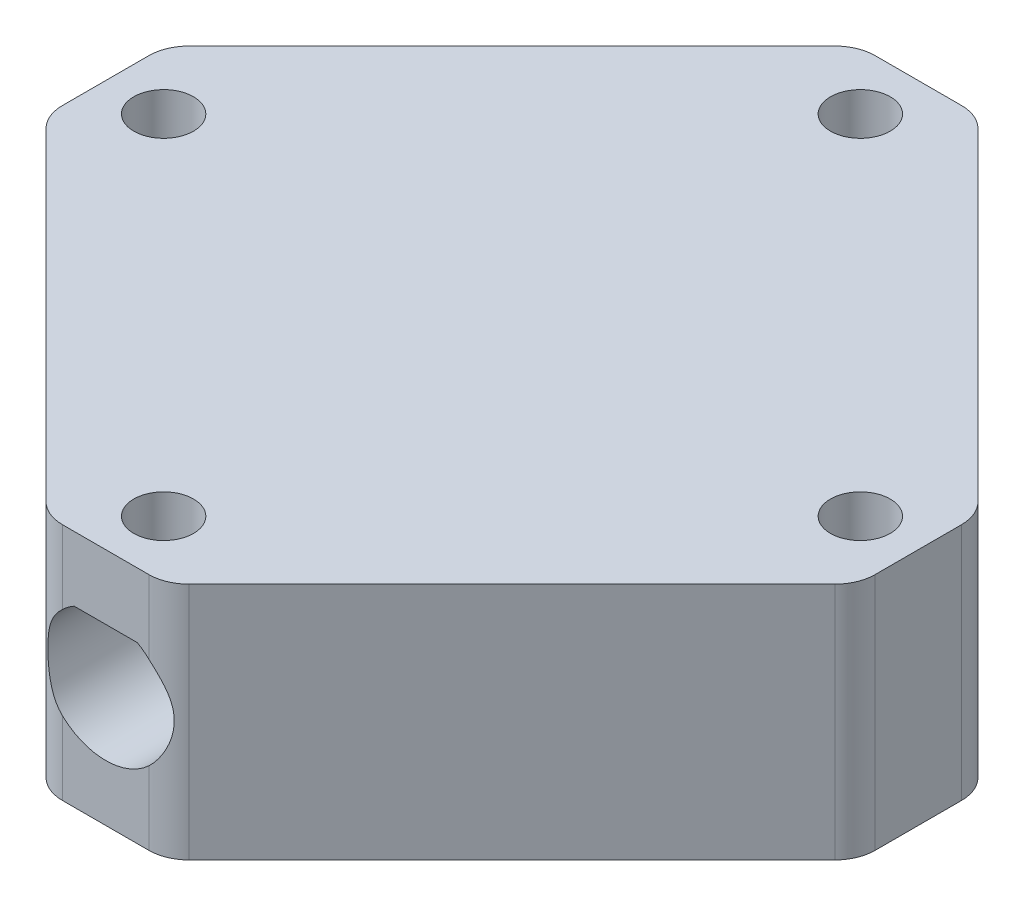
ISO-10303-21;
HEADER;
FILE_DESCRIPTION(('STEP AP214'),'2;1');
FILE_NAME('part.step','',(''),(''),'','','');
FILE_SCHEMA(('AUTOMOTIVE_DESIGN { 1 0 10303 214 1 1 1 1 }'));
ENDSEC;
DATA;
#1=APPLICATION_CONTEXT('core data for automotive mechanical design processes');
#2=APPLICATION_PROTOCOL_DEFINITION('international standard','automotive_design',2000,#1);
#3=PRODUCT_CONTEXT('',#1,'mechanical');
#4=PRODUCT('Part','Part','',(#3));
#5=PRODUCT_RELATED_PRODUCT_CATEGORY('part','',(#4));
#6=PRODUCT_DEFINITION_FORMATION('','',#4);
#7=PRODUCT_DEFINITION_CONTEXT('part definition',#1,'design');
#8=PRODUCT_DEFINITION('design','',#6,#7);
#9=PRODUCT_DEFINITION_SHAPE('','',#8);
#10=(LENGTH_UNIT() NAMED_UNIT(*) SI_UNIT(.MILLI.,.METRE.));
#11=(NAMED_UNIT(*) PLANE_ANGLE_UNIT() SI_UNIT($,.RADIAN.));
#12=(NAMED_UNIT(*) SI_UNIT($,.STERADIAN.) SOLID_ANGLE_UNIT());
#13=UNCERTAINTY_MEASURE_WITH_UNIT(LENGTH_MEASURE(1.E-05),#10,'distance_accuracy_value','');
#14=(GEOMETRIC_REPRESENTATION_CONTEXT(3) GLOBAL_UNCERTAINTY_ASSIGNED_CONTEXT((#13)) GLOBAL_UNIT_ASSIGNED_CONTEXT((#10,
#11,#12)) REPRESENTATION_CONTEXT('',''));
#15=CARTESIAN_POINT('',(0.,0.,0.));
#16=DIRECTION('',(0.,0.,1.));
#17=DIRECTION('',(1.,0.,0.));
#18=AXIS2_PLACEMENT_3D('',#15,#16,#17);
#19=CARTESIAN_POINT('',(-3.00000000000014,12.,20.41));
#20=DIRECTION('',(0.,0.,-1.));
#21=DIRECTION('',(-1.,0.,0.));
#22=AXIS2_PLACEMENT_3D('',#19,#20,#21);
#23=PLANE('',#22);
#24=CARTESIAN_POINT('',(-1.06217118434059E-13,6.,20.41));
#25=DIRECTION('',(0.,0.,1.));
#26=DIRECTION('',(1.,0.,0.));
#27=AXIS2_PLACEMENT_3D('',#24,#25,#26);
#28=CIRCLE('',#27,3.175);
#29=CARTESIAN_POINT('',(2.17157287525374,8.31622456758013,20.41));
#30=VERTEX_POINT('',#29);
#31=CARTESIAN_POINT('',(1.58749999999989,8.74963065701559,20.41));
#32=VERTEX_POINT('',#31);
#33=EDGE_CURVE('E195',#30,#32,#28,.T.);
#34=ORIENTED_EDGE('',*,*,#33,.F.);
#35=DIRECTION('',(0.,-1.,0.));
#36=VECTOR('',#35,1.);
#37=CARTESIAN_POINT('',(2.17157287525374,12.,20.41));
#38=LINE('',#37,#36);
#39=CARTESIAN_POINT('',(2.17157287525374,12.,20.41));
#40=VERTEX_POINT('',#39);
#41=EDGE_CURVE('E466',#30,#40,#38,.F.);
#42=ORIENTED_EDGE('',*,*,#41,.T.);
#43=DIRECTION('',(1.,0.,0.));
#44=VECTOR('',#43,1.);
#45=CARTESIAN_POINT('',(-3.00000000000014,12.,20.41));
#46=LINE('',#45,#44);
#47=CARTESIAN_POINT('',(-2.17157287525395,12.,20.41));
#48=VERTEX_POINT('',#47);
#49=EDGE_CURVE('E240',#48,#40,#46,.T.);
#50=ORIENTED_EDGE('',*,*,#49,.F.);
#51=DIRECTION('',(0.,-1.,0.));
#52=VECTOR('',#51,1.);
#53=CARTESIAN_POINT('',(-2.17157287525395,12.,20.41));
#54=LINE('',#53,#52);
#55=CARTESIAN_POINT('',(-2.17157287525395,8.31622456758013,20.41));
#56=VERTEX_POINT('',#55);
#57=EDGE_CURVE('E51',#48,#56,#54,.T.);
#58=ORIENTED_EDGE('',*,*,#57,.T.);
#59=CARTESIAN_POINT('',(-1.58750000000011,8.74963065701559,20.41));
#60=VERTEX_POINT('',#59);
#61=EDGE_CURVE('E189',#60,#56,#28,.T.);
#62=ORIENTED_EDGE('',*,*,#61,.F.);
#63=DIRECTION('',(-1.,0.,0.));
#64=VECTOR('',#63,1.);
#65=CARTESIAN_POINT('',(1.58749999999989,8.74963065701559,20.41));
#66=LINE('',#65,#64);
#67=EDGE_CURVE('E182',#32,#60,#66,.T.);
#68=ORIENTED_EDGE('',*,*,#67,.F.);
#69=EDGE_LOOP('',(#34,#42,#50,#58,#62,#68));
#70=FACE_BOUND('',#69,.T.);
#71=ADVANCED_FACE('F35',(#70),#23,.F.);
#72=CARTESIAN_POINT('',(20.4100000000002,12.,-3.00000000000029));
#73=DIRECTION('',(-0.707106781186545,0.,0.707106781186549));
#74=DIRECTION('',(0.70710678118655,0.,0.707106781186545));
#75=AXIS2_PLACEMENT_3D('',#72,#73,#74);
#76=PLANE('',#75);
#77=DIRECTION('',(-0.70710678118655,0.,-0.707106781186545));
#78=VECTOR('',#77,1.);
#79=CARTESIAN_POINT('',(20.4100000000002,0.,-3.00000000000029));
#80=LINE('',#79,#78);
#81=CARTESIAN_POINT('',(19.8242135623732,0.,-3.58578643762722));
#82=VERTEX_POINT('',#81);
#83=CARTESIAN_POINT('',(3.58578643762701,0.,-19.8242135623733));
#84=VERTEX_POINT('',#83);
#85=EDGE_CURVE('E203',#82,#84,#80,.T.);
#86=ORIENTED_EDGE('',*,*,#85,.T.);
#87=DIRECTION('',(0.,-1.,0.));
#88=VECTOR('',#87,1.);
#89=CARTESIAN_POINT('',(3.58578643762701,12.,-19.8242135623733));
#90=LINE('',#89,#88);
#91=CARTESIAN_POINT('',(3.58578643762701,12.,-19.8242135623733));
#92=VERTEX_POINT('',#91);
#93=EDGE_CURVE('E328',#84,#92,#90,.F.);
#94=ORIENTED_EDGE('',*,*,#93,.T.);
#95=DIRECTION('',(-0.70710678118655,0.,-0.707106781186545));
#96=VECTOR('',#95,1.);
#97=CARTESIAN_POINT('',(20.4100000000002,12.,-3.00000000000029));
#98=LINE('',#97,#96);
#99=CARTESIAN_POINT('',(19.8242135623732,12.,-3.58578643762722));
#100=VERTEX_POINT('',#99);
#101=EDGE_CURVE('E224',#100,#92,#98,.T.);
#102=ORIENTED_EDGE('',*,*,#101,.F.);
#103=DIRECTION('',(0.,-1.,0.));
#104=VECTOR('',#103,1.);
#105=CARTESIAN_POINT('',(19.8242135623732,12.,-3.58578643762722));
#106=LINE('',#105,#104);
#107=EDGE_CURVE('E325',#100,#82,#106,.T.);
#108=ORIENTED_EDGE('',*,*,#107,.T.);
#109=EDGE_LOOP('',(#86,#94,#102,#108));
#110=FACE_BOUND('',#109,.T.);
#111=ADVANCED_FACE('F425',(#110),#76,.F.);
#112=CARTESIAN_POINT('',(-2.9999999999999,12.,-20.4100000000002));
#113=DIRECTION('',(0.,0.,1.));
#114=DIRECTION('',(1.,0.,0.));
#115=AXIS2_PLACEMENT_3D('',#112,#113,#114);
#116=PLANE('',#115);
#117=DIRECTION('',(-1.,0.,0.));
#118=VECTOR('',#117,1.);
#119=CARTESIAN_POINT('',(-2.9999999999999,0.,-20.4100000000002));
#120=LINE('',#119,#118);
#121=CARTESIAN_POINT('',(2.17157287525392,0.,-20.4100000000002));
#122=VERTEX_POINT('',#121);
#123=CARTESIAN_POINT('',(-2.1715728752537,0.,-20.4100000000002));
#124=VERTEX_POINT('',#123);
#125=EDGE_CURVE('E252',#122,#124,#120,.T.);
#126=ORIENTED_EDGE('',*,*,#125,.T.);
#127=DIRECTION('',(0.,-1.,0.));
#128=VECTOR('',#127,1.);
#129=CARTESIAN_POINT('',(-2.1715728752537,12.,-20.4100000000002));
#130=LINE('',#129,#128);
#131=CARTESIAN_POINT('',(-2.1715728752537,12.,-20.4100000000002));
#132=VERTEX_POINT('',#131);
#133=EDGE_CURVE('E323',#124,#132,#130,.F.);
#134=ORIENTED_EDGE('',*,*,#133,.T.);
#135=DIRECTION('',(-1.,0.,0.));
#136=VECTOR('',#135,1.);
#137=CARTESIAN_POINT('',(-2.9999999999999,12.,-20.4100000000002));
#138=LINE('',#137,#136);
#139=CARTESIAN_POINT('',(2.17157287525392,12.,-20.4100000000002));
#140=VERTEX_POINT('',#139);
#141=EDGE_CURVE('E227',#140,#132,#138,.T.);
#142=ORIENTED_EDGE('',*,*,#141,.F.);
#143=DIRECTION('',(0.,-1.,0.));
#144=VECTOR('',#143,1.);
#145=CARTESIAN_POINT('',(2.17157287525392,12.,-20.4100000000002));
#146=LINE('',#145,#144);
#147=EDGE_CURVE('E320',#140,#122,#146,.T.);
#148=ORIENTED_EDGE('',*,*,#147,.T.);
#149=EDGE_LOOP('',(#126,#134,#142,#148));
#150=FACE_BOUND('',#149,.T.);
#151=ADVANCED_FACE('F421',(#150),#116,.F.);
#152=CARTESIAN_POINT('',(-2.9999999999999,12.,-20.4100000000002));
#153=DIRECTION('',(0.70710678118655,0.,0.707106781186545));
#154=DIRECTION('',(0.707106781186545,0.,-0.70710678118655));
#155=AXIS2_PLACEMENT_3D('',#152,#153,#154);
#156=PLANE('',#155);
#157=DIRECTION('',(-0.707106781186545,0.,0.70710678118655));
#158=VECTOR('',#157,1.);
#159=CARTESIAN_POINT('',(-2.9999999999999,0.,-20.4100000000002));
#160=LINE('',#159,#158);
#161=CARTESIAN_POINT('',(-3.5857864376268,0.,-19.8242135623733));
#162=VERTEX_POINT('',#161);
#163=CARTESIAN_POINT('',(-19.824213562373,0.,-3.58578643762707));
#164=VERTEX_POINT('',#163);
#165=EDGE_CURVE('E255',#162,#164,#160,.T.);
#166=ORIENTED_EDGE('',*,*,#165,.T.);
#167=DIRECTION('',(0.,-1.,0.));
#168=VECTOR('',#167,1.);
#169=CARTESIAN_POINT('',(-19.824213562373,12.,-3.58578643762707));
#170=LINE('',#169,#168);
#171=CARTESIAN_POINT('',(-19.824213562373,12.,-3.58578643762707));
#172=VERTEX_POINT('',#171);
#173=EDGE_CURVE('E318',#164,#172,#170,.F.);
#174=ORIENTED_EDGE('',*,*,#173,.T.);
#175=DIRECTION('',(-0.707106781186545,0.,0.70710678118655));
#176=VECTOR('',#175,1.);
#177=CARTESIAN_POINT('',(-2.9999999999999,12.,-20.4100000000002));
#178=LINE('',#177,#176);
#179=CARTESIAN_POINT('',(-3.5857864376268,12.,-19.8242135623733));
#180=VERTEX_POINT('',#179);
#181=EDGE_CURVE('E231',#180,#172,#178,.T.);
#182=ORIENTED_EDGE('',*,*,#181,.F.);
#183=DIRECTION('',(0.,-1.,0.));
#184=VECTOR('',#183,1.);
#185=CARTESIAN_POINT('',(-3.5857864376268,12.,-19.8242135623733));
#186=LINE('',#185,#184);
#187=EDGE_CURVE('E315',#180,#162,#186,.T.);
#188=ORIENTED_EDGE('',*,*,#187,.T.);
#189=EDGE_LOOP('',(#166,#174,#182,#188));
#190=FACE_BOUND('',#189,.T.);
#191=ADVANCED_FACE('F417',(#190),#156,.F.);
#192=CARTESIAN_POINT('',(-20.41,12.,2.99999999999986));
#193=DIRECTION('',(1.,0.,0.));
#194=DIRECTION('',(0.,0.,-1.));
#195=AXIS2_PLACEMENT_3D('',#192,#193,#194);
#196=PLANE('',#195);
#197=DIRECTION('',(0.,0.,1.));
#198=VECTOR('',#197,1.);
#199=CARTESIAN_POINT('',(-20.41,0.,2.99999999999986));
#200=LINE('',#199,#198);
#201=CARTESIAN_POINT('',(-20.4099999999999,0.,-2.17157287525403));
#202=VERTEX_POINT('',#201);
#203=CARTESIAN_POINT('',(-20.41,0.,2.17157287525364));
#204=VERTEX_POINT('',#203);
#205=EDGE_CURVE('E258',#202,#204,#200,.T.);
#206=ORIENTED_EDGE('',*,*,#205,.T.);
#207=DIRECTION('',(0.,-1.,0.));
#208=VECTOR('',#207,1.);
#209=CARTESIAN_POINT('',(-20.41,12.,2.17157287525364));
#210=LINE('',#209,#208);
#211=CARTESIAN_POINT('',(-20.41,12.,2.17157287525364));
#212=VERTEX_POINT('',#211);
#213=EDGE_CURVE('E296',#204,#212,#210,.F.);
#214=ORIENTED_EDGE('',*,*,#213,.T.);
#215=DIRECTION('',(0.,0.,1.));
#216=VECTOR('',#215,1.);
#217=CARTESIAN_POINT('',(-20.41,12.,2.99999999999986));
#218=LINE('',#217,#216);
#219=CARTESIAN_POINT('',(-20.4099999999999,12.,-2.17157287525403));
#220=VERTEX_POINT('',#219);
#221=EDGE_CURVE('E234',#220,#212,#218,.T.);
#222=ORIENTED_EDGE('',*,*,#221,.F.);
#223=DIRECTION('',(0.,-1.,0.));
#224=VECTOR('',#223,1.);
#225=CARTESIAN_POINT('',(-20.4099999999999,12.,-2.17157287525403));
#226=LINE('',#225,#224);
#227=EDGE_CURVE('E293',#220,#202,#226,.T.);
#228=ORIENTED_EDGE('',*,*,#227,.T.);
#229=EDGE_LOOP('',(#206,#214,#222,#228));
#230=FACE_BOUND('',#229,.T.);
#231=ADVANCED_FACE('F413',(#230),#196,.F.);
#232=CARTESIAN_POINT('',(-20.41,12.,2.99999999999986));
#233=DIRECTION('',(0.707106781186552,0.,-0.707106781186543));
#234=DIRECTION('',(-0.707106781186543,0.,-0.707106781186552));
#235=AXIS2_PLACEMENT_3D('',#232,#233,#234);
#236=PLANE('',#235);
#237=DIRECTION('',(0.707106781186543,0.,0.707106781186552));
#238=VECTOR('',#237,1.);
#239=CARTESIAN_POINT('',(-20.41,12.,2.99999999999986));
#240=LINE('',#239,#238);
#241=CARTESIAN_POINT('',(-19.8242135623731,12.,3.58578643762678));
#242=VERTEX_POINT('',#241);
#243=CARTESIAN_POINT('',(-3.58578643762704,12.,19.8242135623731));
#244=VERTEX_POINT('',#243);
#245=EDGE_CURVE('E237',#242,#244,#240,.T.);
#246=ORIENTED_EDGE('',*,*,#245,.F.);
#247=DIRECTION('',(0.,-1.,0.));
#248=VECTOR('',#247,1.);
#249=CARTESIAN_POINT('',(-19.8242135623731,12.,3.58578643762678));
#250=LINE('',#249,#248);
#251=CARTESIAN_POINT('',(-19.8242135623731,0.,3.58578643762678));
#252=VERTEX_POINT('',#251);
#253=EDGE_CURVE('E273',#242,#252,#250,.T.);
#254=ORIENTED_EDGE('',*,*,#253,.T.);
#255=DIRECTION('',(0.707106781186543,0.,0.707106781186552));
#256=VECTOR('',#255,1.);
#257=CARTESIAN_POINT('',(-20.41,0.,2.99999999999986));
#258=LINE('',#257,#256);
#259=CARTESIAN_POINT('',(-3.58578643762704,0.,19.8242135623731));
#260=VERTEX_POINT('',#259);
#261=EDGE_CURVE('E261',#252,#260,#258,.T.);
#262=ORIENTED_EDGE('',*,*,#261,.T.);
#263=DIRECTION('',(0.,-1.,0.));
#264=VECTOR('',#263,1.);
#265=CARTESIAN_POINT('',(-3.58578643762704,12.,19.8242135623731));
#266=LINE('',#265,#264);
#267=EDGE_CURVE('E249',#260,#244,#266,.F.);
#268=ORIENTED_EDGE('',*,*,#267,.T.);
#269=EDGE_LOOP('',(#246,#254,#262,#268));
#270=FACE_BOUND('',#269,.T.);
#271=ADVANCED_FACE('F409',(#270),#236,.F.);
#272=DIRECTION('',(1.,0.,0.));
#273=VECTOR('',#272,1.);
#274=CARTESIAN_POINT('',(-3.00000000000014,0.,20.41));
#275=LINE('',#274,#273);
#276=CARTESIAN_POINT('',(-2.17157287525395,0.,20.41));
#277=VERTEX_POINT('',#276);
#278=CARTESIAN_POINT('',(2.17157287525374,0.,20.41));
#279=VERTEX_POINT('',#278);
#280=EDGE_CURVE('E264',#277,#279,#275,.T.);
#281=ORIENTED_EDGE('',*,*,#280,.T.);
#282=DIRECTION('',(0.,-1.,0.));
#283=VECTOR('',#282,1.);
#284=CARTESIAN_POINT('',(2.17157287525374,12.,20.41));
#285=LINE('',#284,#283);
#286=CARTESIAN_POINT('',(2.17157287525374,3.68377543241987,20.41));
#287=VERTEX_POINT('',#286);
#288=EDGE_CURVE('E12',#279,#287,#285,.F.);
#289=ORIENTED_EDGE('',*,*,#288,.T.);
#290=CARTESIAN_POINT('',(-2.17157287525395,3.68377543241987,20.41));
#291=VERTEX_POINT('',#290);
#292=EDGE_CURVE('E197',#291,#287,#28,.T.);
#293=ORIENTED_EDGE('',*,*,#292,.F.);
#294=DIRECTION('',(0.,-1.,0.));
#295=VECTOR('',#294,1.);
#296=CARTESIAN_POINT('',(-2.17157287525395,12.,20.41));
#297=LINE('',#296,#295);
#298=EDGE_CURVE('E44',#291,#277,#297,.T.);
#299=ORIENTED_EDGE('',*,*,#298,.T.);
#300=EDGE_LOOP('',(#281,#289,#293,#299));
#301=FACE_BOUND('',#300,.T.);
#302=ADVANCED_FACE('F405',(#301),#23,.F.);
#303=CARTESIAN_POINT('',(2.99999999999993,12.,20.41));
#304=DIRECTION('',(-0.707106781186545,0.,-0.70710678118655));
#305=DIRECTION('',(-0.70710678118655,0.,0.707106781186545));
#306=AXIS2_PLACEMENT_3D('',#303,#304,#305);
#307=PLANE('',#306);
#308=DIRECTION('',(0.70710678118655,0.,-0.707106781186545));
#309=VECTOR('',#308,1.);
#310=CARTESIAN_POINT('',(2.99999999999993,0.,20.41));
#311=LINE('',#310,#309);
#312=CARTESIAN_POINT('',(3.58578643762684,0.,19.8242135623731));
#313=VERTEX_POINT('',#312);
#314=CARTESIAN_POINT('',(19.8242135623731,0.,3.58578643762695));
#315=VERTEX_POINT('',#314);
#316=EDGE_CURVE('E267',#313,#315,#311,.T.);
#317=ORIENTED_EDGE('',*,*,#316,.T.);
#318=DIRECTION('',(0.,-1.,0.));
#319=VECTOR('',#318,1.);
#320=CARTESIAN_POINT('',(19.8242135623731,12.,3.58578643762695));
#321=LINE('',#320,#319);
#322=CARTESIAN_POINT('',(19.8242135623731,12.,3.58578643762695));
#323=VERTEX_POINT('',#322);
#324=EDGE_CURVE('E337',#315,#323,#321,.F.);
#325=ORIENTED_EDGE('',*,*,#324,.T.);
#326=DIRECTION('',(0.70710678118655,0.,-0.707106781186545));
#327=VECTOR('',#326,1.);
#328=CARTESIAN_POINT('',(2.99999999999993,12.,20.41));
#329=LINE('',#328,#327);
#330=CARTESIAN_POINT('',(3.58578643762684,12.,19.8242135623731));
#331=VERTEX_POINT('',#330);
#332=EDGE_CURVE('E243',#331,#323,#329,.T.);
#333=ORIENTED_EDGE('',*,*,#332,.F.);
#334=DIRECTION('',(0.,-1.,0.));
#335=VECTOR('',#334,1.);
#336=CARTESIAN_POINT('',(3.58578643762684,12.,19.8242135623731));
#337=LINE('',#336,#335);
#338=EDGE_CURVE('E335',#331,#313,#337,.T.);
#339=ORIENTED_EDGE('',*,*,#338,.T.);
#340=EDGE_LOOP('',(#317,#325,#333,#339));
#341=FACE_BOUND('',#340,.T.);
#342=ADVANCED_FACE('F401',(#341),#307,.F.);
#343=CARTESIAN_POINT('',(20.41,12.,3.00000000000007));
#344=DIRECTION('',(-1.,0.,0.));
#345=DIRECTION('',(0.,0.,1.));
#346=AXIS2_PLACEMENT_3D('',#343,#344,#345);
#347=PLANE('',#346);
#348=DIRECTION('',(0.,0.,-1.));
#349=VECTOR('',#348,1.);
#350=CARTESIAN_POINT('',(20.41,0.,3.00000000000007));
#351=LINE('',#350,#349);
#352=CARTESIAN_POINT('',(20.41,0.,2.17157287525391));
#353=VERTEX_POINT('',#352);
#354=CARTESIAN_POINT('',(20.4100000000001,0.,-2.17157287525407));
#355=VERTEX_POINT('',#354);
#356=EDGE_CURVE('E228',#353,#355,#351,.T.);
#357=ORIENTED_EDGE('',*,*,#356,.T.);
#358=DIRECTION('',(0.,-1.,0.));
#359=VECTOR('',#358,1.);
#360=CARTESIAN_POINT('',(20.4100000000001,12.,-2.17157287525407));
#361=LINE('',#360,#359);
#362=CARTESIAN_POINT('',(20.4100000000001,12.,-2.17157287525407));
#363=VERTEX_POINT('',#362);
#364=EDGE_CURVE('E333',#355,#363,#361,.F.);
#365=ORIENTED_EDGE('',*,*,#364,.T.);
#366=DIRECTION('',(0.,0.,-1.));
#367=VECTOR('',#366,1.);
#368=CARTESIAN_POINT('',(20.41,12.,3.00000000000007));
#369=LINE('',#368,#367);
#370=CARTESIAN_POINT('',(20.41,12.,2.17157287525391));
#371=VERTEX_POINT('',#370);
#372=EDGE_CURVE('E246',#371,#363,#369,.T.);
#373=ORIENTED_EDGE('',*,*,#372,.F.);
#374=DIRECTION('',(0.,-1.,0.));
#375=VECTOR('',#374,1.);
#376=CARTESIAN_POINT('',(20.41,12.,2.17157287525391));
#377=LINE('',#376,#375);
#378=EDGE_CURVE('E330',#371,#353,#377,.T.);
#379=ORIENTED_EDGE('',*,*,#378,.T.);
#380=EDGE_LOOP('',(#357,#365,#373,#379));
#381=FACE_BOUND('',#380,.T.);
#382=ADVANCED_FACE('F394',(#381),#347,.F.);
#383=CARTESIAN_POINT('',(0.,12.,0.));
#384=DIRECTION('',(0.,1.,0.));
#385=DIRECTION('',(0.,0.,1.));
#386=AXIS2_PLACEMENT_3D('',#383,#384,#385);
#387=PLANE('',#386);
#388=CARTESIAN_POINT('',(17.5,12.,0.));
#389=DIRECTION('',(0.,1.,0.));
#390=DIRECTION('',(0.,0.,1.));
#391=AXIS2_PLACEMENT_3D('',#388,#389,#390);
#392=CIRCLE('',#391,1.5);
#393=CARTESIAN_POINT('',(17.5,12.,1.5));
#394=VERTEX_POINT('',#393);
#395=EDGE_CURVE('E204',#394,#394,#392,.T.);
#396=ORIENTED_EDGE('',*,*,#395,.F.);
#397=EDGE_LOOP('',(#396));
#398=FACE_BOUND('',#397,.T.);
#399=CARTESIAN_POINT('',(0.,12.,17.5));
#400=DIRECTION('',(0.,1.,0.));
#401=DIRECTION('',(0.,0.,1.));
#402=AXIS2_PLACEMENT_3D('',#399,#400,#401);
#403=CIRCLE('',#402,1.5);
#404=CARTESIAN_POINT('',(0.,12.,19.));
#405=VERTEX_POINT('',#404);
#406=EDGE_CURVE('E210',#405,#405,#403,.T.);
#407=ORIENTED_EDGE('',*,*,#406,.F.);
#408=EDGE_LOOP('',(#407));
#409=FACE_BOUND('',#408,.T.);
#410=CARTESIAN_POINT('',(-17.5,12.,0.));
#411=DIRECTION('',(0.,1.,0.));
#412=DIRECTION('',(0.,0.,1.));
#413=AXIS2_PLACEMENT_3D('',#410,#411,#412);
#414=CIRCLE('',#413,1.5);
#415=CARTESIAN_POINT('',(-17.5,12.,1.5));
#416=VERTEX_POINT('',#415);
#417=EDGE_CURVE('E216',#416,#416,#414,.T.);
#418=ORIENTED_EDGE('',*,*,#417,.F.);
#419=EDGE_LOOP('',(#418));
#420=FACE_BOUND('',#419,.T.);
#421=CARTESIAN_POINT('',(0.,12.,-17.5));
#422=DIRECTION('',(0.,1.,0.));
#423=DIRECTION('',(0.,0.,1.));
#424=AXIS2_PLACEMENT_3D('',#421,#422,#423);
#425=CIRCLE('',#424,1.5);
#426=CARTESIAN_POINT('',(0.,12.,-16.));
#427=VERTEX_POINT('',#426);
#428=EDGE_CURVE('E198',#427,#427,#425,.T.);
#429=ORIENTED_EDGE('',*,*,#428,.F.);
#430=EDGE_LOOP('',(#429));
#431=FACE_BOUND('',#430,.T.);
#432=ORIENTED_EDGE('',*,*,#221,.T.);
#433=CARTESIAN_POINT('',(-18.41,12.,2.1715728752537));
#434=DIRECTION('',(0.,1.,0.));
#435=DIRECTION('',(0.,0.,1.));
#436=AXIS2_PLACEMENT_3D('',#433,#434,#435);
#437=CIRCLE('',#436,2.);
#438=EDGE_CURVE('E313',#212,#242,#437,.T.);
#439=ORIENTED_EDGE('',*,*,#438,.T.);
#440=ORIENTED_EDGE('',*,*,#245,.T.);
#441=CARTESIAN_POINT('',(-2.17157287525394,12.,18.41));
#442=DIRECTION('',(0.,1.,0.));
#443=DIRECTION('',(0.,0.,1.));
#444=AXIS2_PLACEMENT_3D('',#441,#442,#443);
#445=CIRCLE('',#444,2.);
#446=EDGE_CURVE('E298',#244,#48,#445,.T.);
#447=ORIENTED_EDGE('',*,*,#446,.T.);
#448=ORIENTED_EDGE('',*,*,#49,.T.);
#449=CARTESIAN_POINT('',(2.17157287525375,12.,18.41));
#450=DIRECTION('',(0.,1.,0.));
#451=DIRECTION('',(0.,0.,1.));
#452=AXIS2_PLACEMENT_3D('',#449,#450,#451);
#453=CIRCLE('',#452,2.);
#454=EDGE_CURVE('E300',#40,#331,#453,.T.);
#455=ORIENTED_EDGE('',*,*,#454,.T.);
#456=ORIENTED_EDGE('',*,*,#332,.T.);
#457=CARTESIAN_POINT('',(18.41,12.,2.17157287525385));
#458=DIRECTION('',(0.,1.,0.));
#459=DIRECTION('',(0.,0.,1.));
#460=AXIS2_PLACEMENT_3D('',#457,#458,#459);
#461=CIRCLE('',#460,2.);
#462=EDGE_CURVE('E303',#323,#371,#461,.T.);
#463=ORIENTED_EDGE('',*,*,#462,.T.);
#464=ORIENTED_EDGE('',*,*,#372,.T.);
#465=CARTESIAN_POINT('',(18.4100000000001,12.,-2.17157287525412));
#466=DIRECTION('',(0.,1.,0.));
#467=DIRECTION('',(0.,0.,1.));
#468=AXIS2_PLACEMENT_3D('',#465,#466,#467);
#469=CIRCLE('',#468,2.);
#470=EDGE_CURVE('E305',#363,#100,#469,.T.);
#471=ORIENTED_EDGE('',*,*,#470,.T.);
#472=ORIENTED_EDGE('',*,*,#101,.T.);
#473=CARTESIAN_POINT('',(2.17157287525392,12.,-18.4100000000002));
#474=DIRECTION('',(0.,1.,0.));
#475=DIRECTION('',(0.,0.,1.));
#476=AXIS2_PLACEMENT_3D('',#473,#474,#475);
#477=CIRCLE('',#476,2.);
#478=EDGE_CURVE('E307',#92,#140,#477,.T.);
#479=ORIENTED_EDGE('',*,*,#478,.T.);
#480=ORIENTED_EDGE('',*,*,#141,.T.);
#481=CARTESIAN_POINT('',(-2.1715728752537,12.,-18.4100000000002));
#482=DIRECTION('',(0.,1.,0.));
#483=DIRECTION('',(0.,0.,1.));
#484=AXIS2_PLACEMENT_3D('',#481,#482,#483);
#485=CIRCLE('',#484,2.);
#486=EDGE_CURVE('E309',#132,#180,#485,.T.);
#487=ORIENTED_EDGE('',*,*,#486,.T.);
#488=ORIENTED_EDGE('',*,*,#181,.T.);
#489=CARTESIAN_POINT('',(-18.4099999999999,12.,-2.17157287525397));
#490=DIRECTION('',(0.,1.,0.));
#491=DIRECTION('',(0.,0.,1.));
#492=AXIS2_PLACEMENT_3D('',#489,#490,#491);
#493=CIRCLE('',#492,2.);
#494=EDGE_CURVE('E311',#172,#220,#493,.T.);
#495=ORIENTED_EDGE('',*,*,#494,.T.);
#496=EDGE_LOOP('',(#432,#439,#440,#447,#448,#455,#456,#463,#464,#471,#472,#479,#480,#487,#488,#495));
#497=FACE_BOUND('',#496,.T.);
#498=ADVANCED_FACE('F391',(#398,#409,#420,#431,#497),#387,.T.);
#499=CARTESIAN_POINT('',(0.,0.,0.));
#500=DIRECTION('',(0.,1.,0.));
#501=DIRECTION('',(0.,0.,1.));
#502=AXIS2_PLACEMENT_3D('',#499,#500,#501);
#503=PLANE('',#502);
#504=ORIENTED_EDGE('',*,*,#261,.F.);
#505=CARTESIAN_POINT('',(-18.41,0.,2.1715728752537));
#506=DIRECTION('',(0.,1.,0.));
#507=DIRECTION('',(0.,0.,1.));
#508=AXIS2_PLACEMENT_3D('',#505,#506,#507);
#509=CIRCLE('',#508,2.);
#510=EDGE_CURVE('E291',#252,#204,#509,.F.);
#511=ORIENTED_EDGE('',*,*,#510,.T.);
#512=ORIENTED_EDGE('',*,*,#205,.F.);
#513=CARTESIAN_POINT('',(-18.4099999999999,0.,-2.17157287525397));
#514=DIRECTION('',(0.,1.,0.));
#515=DIRECTION('',(0.,0.,1.));
#516=AXIS2_PLACEMENT_3D('',#513,#514,#515);
#517=CIRCLE('',#516,2.);
#518=EDGE_CURVE('E289',#202,#164,#517,.F.);
#519=ORIENTED_EDGE('',*,*,#518,.T.);
#520=ORIENTED_EDGE('',*,*,#165,.F.);
#521=CARTESIAN_POINT('',(-2.1715728752537,0.,-18.4100000000002));
#522=DIRECTION('',(0.,1.,0.));
#523=DIRECTION('',(0.,0.,1.));
#524=AXIS2_PLACEMENT_3D('',#521,#522,#523);
#525=CIRCLE('',#524,2.);
#526=EDGE_CURVE('E287',#162,#124,#525,.F.);
#527=ORIENTED_EDGE('',*,*,#526,.T.);
#528=ORIENTED_EDGE('',*,*,#125,.F.);
#529=CARTESIAN_POINT('',(2.17157287525392,0.,-18.4100000000002));
#530=DIRECTION('',(0.,1.,0.));
#531=DIRECTION('',(0.,0.,1.));
#532=AXIS2_PLACEMENT_3D('',#529,#530,#531);
#533=CIRCLE('',#532,2.);
#534=EDGE_CURVE('E285',#122,#84,#533,.F.);
#535=ORIENTED_EDGE('',*,*,#534,.T.);
#536=ORIENTED_EDGE('',*,*,#85,.F.);
#537=CARTESIAN_POINT('',(18.4100000000001,0.,-2.17157287525412));
#538=DIRECTION('',(0.,1.,0.));
#539=DIRECTION('',(0.,0.,1.));
#540=AXIS2_PLACEMENT_3D('',#537,#538,#539);
#541=CIRCLE('',#540,2.);
#542=EDGE_CURVE('E283',#82,#355,#541,.F.);
#543=ORIENTED_EDGE('',*,*,#542,.T.);
#544=ORIENTED_EDGE('',*,*,#356,.F.);
#545=CARTESIAN_POINT('',(18.41,0.,2.17157287525385));
#546=DIRECTION('',(0.,1.,0.));
#547=DIRECTION('',(0.,0.,1.));
#548=AXIS2_PLACEMENT_3D('',#545,#546,#547);
#549=CIRCLE('',#548,2.);
#550=EDGE_CURVE('E281',#353,#315,#549,.F.);
#551=ORIENTED_EDGE('',*,*,#550,.T.);
#552=ORIENTED_EDGE('',*,*,#316,.F.);
#553=CARTESIAN_POINT('',(2.17157287525375,0.,18.41));
#554=DIRECTION('',(0.,1.,0.));
#555=DIRECTION('',(0.,0.,1.));
#556=AXIS2_PLACEMENT_3D('',#553,#554,#555);
#557=CIRCLE('',#556,2.);
#558=EDGE_CURVE('E279',#313,#279,#557,.F.);
#559=ORIENTED_EDGE('',*,*,#558,.T.);
#560=ORIENTED_EDGE('',*,*,#280,.F.);
#561=CARTESIAN_POINT('',(-2.17157287525394,0.,18.41));
#562=DIRECTION('',(0.,1.,0.));
#563=DIRECTION('',(0.,0.,1.));
#564=AXIS2_PLACEMENT_3D('',#561,#562,#563);
#565=CIRCLE('',#564,2.);
#566=EDGE_CURVE('E276',#277,#260,#565,.F.);
#567=ORIENTED_EDGE('',*,*,#566,.T.);
#568=EDGE_LOOP('',(#504,#511,#512,#519,#520,#527,#528,#535,#536,#543,#544,#551,#552,#559,#560,#567));
#569=FACE_BOUND('',#568,.T.);
#570=ADVANCED_FACE('F389',(#569),#503,.F.);
#571=CARTESIAN_POINT('',(0.,9.,-17.5));
#572=DIRECTION('',(0.,1.,0.));
#573=DIRECTION('',(0.,0.,1.));
#574=AXIS2_PLACEMENT_3D('',#571,#572,#573);
#575=CYLINDRICAL_SURFACE('',#574,1.5);
#576=CARTESIAN_POINT('',(0.,9.,-17.5));
#577=DIRECTION('',(0.,1.,0.));
#578=DIRECTION('',(0.,0.,1.));
#579=AXIS2_PLACEMENT_3D('',#576,#577,#578);
#580=CIRCLE('',#579,1.5);
#581=CARTESIAN_POINT('',(0.,9.,-16.));
#582=VERTEX_POINT('',#581);
#583=EDGE_CURVE('E219',#582,#582,#580,.T.);
#584=ORIENTED_EDGE('',*,*,#583,.F.);
#585=EDGE_LOOP('',(#584));
#586=FACE_BOUND('',#585,.T.);
#587=ORIENTED_EDGE('',*,*,#428,.T.);
#588=EDGE_LOOP('',(#587));
#589=FACE_BOUND('',#588,.T.);
#590=ADVANCED_FACE('F385',(#586,#589),#575,.F.);
#591=CARTESIAN_POINT('',(0.,9.,-17.5));
#592=DIRECTION('',(0.,1.,0.));
#593=DIRECTION('',(0.,0.,1.));
#594=AXIS2_PLACEMENT_3D('',#591,#592,#593);
#595=PLANE('',#594);
#596=ORIENTED_EDGE('',*,*,#583,.T.);
#597=EDGE_LOOP('',(#596));
#598=FACE_BOUND('',#597,.T.);
#599=ADVANCED_FACE('F381',(#598),#595,.T.);
#600=CARTESIAN_POINT('',(-17.5,9.,0.));
#601=DIRECTION('',(0.,1.,0.));
#602=DIRECTION('',(0.,0.,1.));
#603=AXIS2_PLACEMENT_3D('',#600,#601,#602);
#604=CYLINDRICAL_SURFACE('',#603,1.5);
#605=CARTESIAN_POINT('',(-17.5,9.,0.));
#606=DIRECTION('',(0.,1.,0.));
#607=DIRECTION('',(0.,0.,1.));
#608=AXIS2_PLACEMENT_3D('',#605,#606,#607);
#609=CIRCLE('',#608,1.5);
#610=CARTESIAN_POINT('',(-17.5,9.,1.5));
#611=VERTEX_POINT('',#610);
#612=EDGE_CURVE('E213',#611,#611,#609,.T.);
#613=ORIENTED_EDGE('',*,*,#612,.F.);
#614=EDGE_LOOP('',(#613));
#615=FACE_BOUND('',#614,.T.);
#616=ORIENTED_EDGE('',*,*,#417,.T.);
#617=EDGE_LOOP('',(#616));
#618=FACE_BOUND('',#617,.T.);
#619=ADVANCED_FACE('F377',(#615,#618),#604,.F.);
#620=CARTESIAN_POINT('',(-17.5,9.,0.));
#621=DIRECTION('',(0.,1.,0.));
#622=DIRECTION('',(0.,0.,1.));
#623=AXIS2_PLACEMENT_3D('',#620,#621,#622);
#624=PLANE('',#623);
#625=ORIENTED_EDGE('',*,*,#612,.T.);
#626=EDGE_LOOP('',(#625));
#627=FACE_BOUND('',#626,.T.);
#628=ADVANCED_FACE('F373',(#627),#624,.T.);
#629=CARTESIAN_POINT('',(0.,9.,17.5));
#630=DIRECTION('',(0.,1.,0.));
#631=DIRECTION('',(0.,0.,1.));
#632=AXIS2_PLACEMENT_3D('',#629,#630,#631);
#633=CYLINDRICAL_SURFACE('',#632,1.5);
#634=CARTESIAN_POINT('',(0.,9.,17.5));
#635=DIRECTION('',(0.,1.,0.));
#636=DIRECTION('',(0.,0.,1.));
#637=AXIS2_PLACEMENT_3D('',#634,#635,#636);
#638=CIRCLE('',#637,1.5);
#639=CARTESIAN_POINT('',(0.,9.,19.));
#640=VERTEX_POINT('',#639);
#641=EDGE_CURVE('E207',#640,#640,#638,.T.);
#642=ORIENTED_EDGE('',*,*,#641,.F.);
#643=EDGE_LOOP('',(#642));
#644=FACE_BOUND('',#643,.T.);
#645=ORIENTED_EDGE('',*,*,#406,.T.);
#646=EDGE_LOOP('',(#645));
#647=FACE_BOUND('',#646,.T.);
#648=ADVANCED_FACE('F369',(#644,#647),#633,.F.);
#649=CARTESIAN_POINT('',(0.,9.,17.5));
#650=DIRECTION('',(0.,1.,0.));
#651=DIRECTION('',(0.,0.,1.));
#652=AXIS2_PLACEMENT_3D('',#649,#650,#651);
#653=PLANE('',#652);
#654=ORIENTED_EDGE('',*,*,#641,.T.);
#655=EDGE_LOOP('',(#654));
#656=FACE_BOUND('',#655,.T.);
#657=ADVANCED_FACE('F365',(#656),#653,.T.);
#658=CARTESIAN_POINT('',(17.5,9.,0.));
#659=DIRECTION('',(0.,1.,0.));
#660=DIRECTION('',(0.,0.,1.));
#661=AXIS2_PLACEMENT_3D('',#658,#659,#660);
#662=CYLINDRICAL_SURFACE('',#661,1.5);
#663=CARTESIAN_POINT('',(17.5,9.,0.));
#664=DIRECTION('',(0.,1.,0.));
#665=DIRECTION('',(0.,0.,1.));
#666=AXIS2_PLACEMENT_3D('',#663,#664,#665);
#667=CIRCLE('',#666,1.5);
#668=CARTESIAN_POINT('',(17.5,9.,1.5));
#669=VERTEX_POINT('',#668);
#670=EDGE_CURVE('E200',#669,#669,#667,.T.);
#671=ORIENTED_EDGE('',*,*,#670,.F.);
#672=EDGE_LOOP('',(#671));
#673=FACE_BOUND('',#672,.T.);
#674=ORIENTED_EDGE('',*,*,#395,.T.);
#675=EDGE_LOOP('',(#674));
#676=FACE_BOUND('',#675,.T.);
#677=ADVANCED_FACE('F361',(#673,#676),#662,.F.);
#678=CARTESIAN_POINT('',(17.5,9.,0.));
#679=DIRECTION('',(0.,1.,0.));
#680=DIRECTION('',(0.,0.,1.));
#681=AXIS2_PLACEMENT_3D('',#678,#679,#680);
#682=PLANE('',#681);
#683=ORIENTED_EDGE('',*,*,#670,.T.);
#684=EDGE_LOOP('',(#683));
#685=FACE_BOUND('',#684,.T.);
#686=ADVANCED_FACE('F355',(#685),#682,.T.);
#687=CARTESIAN_POINT('',(-1.06217118434059E-13,6.,-4.99));
#688=DIRECTION('',(0.,0.,1.));
#689=DIRECTION('',(1.,0.,0.));
#690=AXIS2_PLACEMENT_3D('',#687,#688,#689);
#691=CYLINDRICAL_SURFACE('',#690,3.175);
#692=CARTESIAN_POINT('',(2.17157287525374,3.68377543241987,20.41));
#693=CARTESIAN_POINT('',(2.23397402082878,3.74226867209089,20.4099906031605));
#694=CARTESIAN_POINT('',(2.29391394868375,3.80321424362954,20.4070821699325));
#695=CARTESIAN_POINT('',(2.40844037650511,3.9294254653079,20.3967563295692));
#696=CARTESIAN_POINT('',(2.46303528939149,3.99468404653002,20.3893461450094));
#697=CARTESIAN_POINT('',(2.61812427642637,4.19593076192818,20.3623295111205));
#698=CARTESIAN_POINT('',(2.71031378411488,4.33775887295602,20.3379209613265));
#699=CARTESIAN_POINT('',(2.86635256998803,4.62524078385085,20.2871347267604));
#700=CARTESIAN_POINT('',(2.93149498899505,4.77024081297512,20.2609426076424));
#701=CARTESIAN_POINT('',(3.03962857978288,5.06916128200913,20.212779909271));
#702=CARTESIAN_POINT('',(3.0826172567271,5.22308272443058,20.190809805653));
#703=CARTESIAN_POINT('',(3.13132488037366,5.46759080318663,20.1647795084354));
#704=CARTESIAN_POINT('',(3.14511990509979,5.55624615198785,20.15709235486));
#705=CARTESIAN_POINT('',(3.16516763481631,5.73469026578092,20.1457733026018));
#706=CARTESIAN_POINT('',(3.17142034470487,5.82447903003665,20.1421414012854));
#707=CARTESIAN_POINT('',(3.17626950887947,6.00425064578138,20.1393326980665));
#708=CARTESIAN_POINT('',(3.17487271889793,6.09423325587786,20.1401519650649));
#709=CARTESIAN_POINT('',(3.1644644212717,6.27360451186207,20.1461457644909));
#710=CARTESIAN_POINT('',(3.15545328325497,6.36299318636929,20.1513200855083));
#711=CARTESIAN_POINT('',(3.13157859276359,6.52911585580935,20.1645790978584));
#712=CARTESIAN_POINT('',(3.1176028507236,6.60601621571681,20.1722111238425));
#713=CARTESIAN_POINT('',(3.08409378804698,6.7583366718928,20.1897923483032));
#714=CARTESIAN_POINT('',(3.06455874246583,6.83375630094272,20.1997422658027));
#715=CARTESIAN_POINT('',(2.99776340187313,7.05749571734078,20.2320530647797));
#716=CARTESIAN_POINT('',(2.94234440156287,7.20308008767831,20.2568542226421));
#717=CARTESIAN_POINT('',(2.80344469066203,7.50038151341933,20.3091635328816));
#718=CARTESIAN_POINT('',(2.71752383851733,7.65097201316344,20.336665137119));
#719=CARTESIAN_POINT('',(2.57077077340324,7.86527208069895,20.3703950140994));
#720=CARTESIAN_POINT('',(2.51896255332811,7.93468209639779,20.3803754924457));
#721=CARTESIAN_POINT('',(2.40961293364148,8.06927141304133,20.3965516021241));
#722=CARTESIAN_POINT('',(2.35207656126879,8.13445434228362,20.4027505188218));
#723=CARTESIAN_POINT('',(2.25287861845899,8.23793665462483,20.4087286911976));
#724=CARTESIAN_POINT('',(2.21274767059389,8.27763066735186,20.4099987242215));
#725=CARTESIAN_POINT('',(2.17157287525374,8.31622456758013,20.41));
#726=B_SPLINE_CURVE_WITH_KNOTS('',3,(#692,#693,#694,#695,#696,#697,#698,#699,#700,#701,#702,
#703,#704,#705,#706,#707,#708,#709,#710,#711,#712,#713,#714,#715,#716,#717,#718,#719,#720,#721,
#722,#723,#724,#725),.UNSPECIFIED.,.F.,.F.,(4,2,2,2,2,2,2,2,2,2,2,2,2,2,2,2,4),(0.,
0.256281982585972,0.51215387022793,1.02230763679362,1.50402869722281,1.98580399466717,
2.25560209642657,2.52540002297264,2.79495971322488,3.06450631882738,3.29984655983256,
3.53525990213411,4.00673710819128,4.53079134074165,4.79206104856473,5.05310344460973,
5.22236960678169),.UNSPECIFIED.);
#727=EDGE_CURVE('E59',#287,#30,#726,.T.);
#728=ORIENTED_EDGE('',*,*,#727,.T.);
#729=ORIENTED_EDGE('',*,*,#33,.T.);
#730=DIRECTION('',(0.,0.,1.));
#731=VECTOR('',#730,1.);
#732=CARTESIAN_POINT('',(1.58749999999989,8.74963065701559,-4.99));
#733=LINE('',#732,#731);
#734=CARTESIAN_POINT('',(1.58749999999989,8.74963065701559,-4.99));
#735=VERTEX_POINT('',#734);
#736=EDGE_CURVE('E184',#735,#32,#733,.T.);
#737=ORIENTED_EDGE('',*,*,#736,.F.);
#738=CARTESIAN_POINT('',(-1.06217118434059E-13,6.,-4.99));
#739=DIRECTION('',(0.,0.,1.));
#740=DIRECTION('',(1.,0.,0.));
#741=AXIS2_PLACEMENT_3D('',#738,#739,#740);
#742=CIRCLE('',#741,3.175);
#743=CARTESIAN_POINT('',(-1.58750000000011,8.74963065701559,-4.99));
#744=VERTEX_POINT('',#743);
#745=EDGE_CURVE('E185',#744,#735,#742,.T.);
#746=ORIENTED_EDGE('',*,*,#745,.F.);
#747=DIRECTION('',(0.,0.,1.));
#748=VECTOR('',#747,1.);
#749=CARTESIAN_POINT('',(-1.58750000000011,8.74963065701559,-4.99));
#750=LINE('',#749,#748);
#751=EDGE_CURVE('E175',#744,#60,#750,.T.);
#752=ORIENTED_EDGE('',*,*,#751,.T.);
#753=ORIENTED_EDGE('',*,*,#61,.T.);
#754=CARTESIAN_POINT('',(-2.17157287525395,8.31622456758013,20.41));
#755=CARTESIAN_POINT('',(-2.23397402082899,8.25773132790912,20.4099906031605));
#756=CARTESIAN_POINT('',(-2.29391394868396,8.19678575637046,20.4070821699325));
#757=CARTESIAN_POINT('',(-2.40844037650532,8.0705745346921,20.3967563295692));
#758=CARTESIAN_POINT('',(-2.4630352893917,8.00531595346998,20.3893461450094));
#759=CARTESIAN_POINT('',(-2.61812427642658,7.80406923807183,20.3623295111204));
#760=CARTESIAN_POINT('',(-2.71031378411509,7.66224112704398,20.3379209613265));
#761=CARTESIAN_POINT('',(-2.86635256998825,7.37475921614915,20.2871347267604));
#762=CARTESIAN_POINT('',(-2.93149498899526,7.22975918702488,20.2609426076424));
#763=CARTESIAN_POINT('',(-3.03962857978309,6.93083871799087,20.212779909271));
#764=CARTESIAN_POINT('',(-3.08261725672732,6.77691727556942,20.190809805653));
#765=CARTESIAN_POINT('',(-3.13132488037387,6.53240919681337,20.1647795084354));
#766=CARTESIAN_POINT('',(-3.1451199051,6.44375384801215,20.15709235486));
#767=CARTESIAN_POINT('',(-3.16516763481652,6.26530973421908,20.1457733026018));
#768=CARTESIAN_POINT('',(-3.17142034470508,6.17552096996335,20.1421414012854));
#769=CARTESIAN_POINT('',(-3.17626950887968,5.99574935421862,20.1393326980664));
#770=CARTESIAN_POINT('',(-3.17487271889814,5.90576674412214,20.1401519650649));
#771=CARTESIAN_POINT('',(-3.16446442127191,5.72639548813793,20.1461457644909));
#772=CARTESIAN_POINT('',(-3.15545328325518,5.63700681363071,20.1513200855083));
#773=CARTESIAN_POINT('',(-3.1315785927638,5.47088414419065,20.1645790978584));
#774=CARTESIAN_POINT('',(-3.11760285072381,5.39398378428319,20.1722111238425));
#775=CARTESIAN_POINT('',(-3.08409378804719,5.2416633281072,20.1897923483032));
#776=CARTESIAN_POINT('',(-3.06455874246605,5.16624369905729,20.1997422658026));
#777=CARTESIAN_POINT('',(-2.99776340187335,4.94250428265922,20.2320530647796));
#778=CARTESIAN_POINT('',(-2.94234440156308,4.7969199123217,20.256854222642));
#779=CARTESIAN_POINT('',(-2.80344469066225,4.49961848658068,20.3091635328816));
#780=CARTESIAN_POINT('',(-2.71752383851754,4.34902798683656,20.336665137119));
#781=CARTESIAN_POINT('',(-2.57077077340345,4.13472791930105,20.3703950140994));
#782=CARTESIAN_POINT('',(-2.51896255332833,4.06531790360222,20.3803754924456));
#783=CARTESIAN_POINT('',(-2.4096129336417,3.93072858695868,20.3965516021241));
#784=CARTESIAN_POINT('',(-2.35207656126901,3.86554565771639,20.4027505188218));
#785=CARTESIAN_POINT('',(-2.25287861845921,3.76206334537518,20.4087286911975));
#786=CARTESIAN_POINT('',(-2.2127476705941,3.72236933264815,20.4099987242215));
#787=CARTESIAN_POINT('',(-2.17157287525395,3.68377543241987,20.41));
#788=B_SPLINE_CURVE_WITH_KNOTS('',3,(#754,#755,#756,#757,#758,#759,#760,#761,#762,#763,#764,
#765,#766,#767,#768,#769,#770,#771,#772,#773,#774,#775,#776,#777,#778,#779,#780,#781,#782,#783,
#784,#785,#786,#787),.UNSPECIFIED.,.F.,.F.,(4,2,2,2,2,2,2,2,2,2,2,2,2,2,2,2,4),(0.,
0.256281982585972,0.512153870227931,1.02230763679362,1.50402869722281,1.98580399466717,
2.25560209642658,2.52540002297264,2.79495971322488,3.06450631882739,3.29984655983256,
3.53525990213411,4.00673710819127,4.53079134074164,4.79206104856472,5.05310344460973,
5.2223696067817),.UNSPECIFIED.);
#789=EDGE_CURVE('E339',#56,#291,#788,.T.);
#790=ORIENTED_EDGE('',*,*,#789,.T.);
#791=ORIENTED_EDGE('',*,*,#292,.T.);
#792=EDGE_LOOP('',(#728,#729,#737,#746,#752,#753,#790,#791));
#793=FACE_BOUND('',#792,.T.);
#794=ADVANCED_FACE('F191',(#793),#691,.F.);
#795=CARTESIAN_POINT('',(1.58749999999989,8.74963065701559,-4.99));
#796=DIRECTION('',(0.,1.,0.));
#797=DIRECTION('',(0.,0.,1.));
#798=AXIS2_PLACEMENT_3D('',#795,#796,#797);
#799=PLANE('',#798);
#800=ORIENTED_EDGE('',*,*,#67,.T.);
#801=ORIENTED_EDGE('',*,*,#751,.F.);
#802=DIRECTION('',(-1.,0.,0.));
#803=VECTOR('',#802,1.);
#804=CARTESIAN_POINT('',(1.58749999999989,8.74963065701559,-4.99));
#805=LINE('',#804,#803);
#806=EDGE_CURVE('E179',#735,#744,#805,.T.);
#807=ORIENTED_EDGE('',*,*,#806,.F.);
#808=ORIENTED_EDGE('',*,*,#736,.T.);
#809=EDGE_LOOP('',(#800,#801,#807,#808));
#810=FACE_BOUND('',#809,.T.);
#811=ADVANCED_FACE('F177',(#810),#799,.F.);
#812=CARTESIAN_POINT('',(-1.06217118434059E-13,6.,-4.99));
#813=DIRECTION('',(0.,0.,1.));
#814=DIRECTION('',(1.,0.,0.));
#815=AXIS2_PLACEMENT_3D('',#812,#813,#814);
#816=PLANE('',#815);
#817=ORIENTED_EDGE('',*,*,#806,.T.);
#818=ORIENTED_EDGE('',*,*,#745,.T.);
#819=EDGE_LOOP('',(#817,#818));
#820=FACE_BOUND('',#819,.T.);
#821=ADVANCED_FACE('F188',(#820),#816,.T.);
#822=CARTESIAN_POINT('',(-18.41,12.,2.1715728752537));
#823=DIRECTION('',(0.,-1.,0.));
#824=DIRECTION('',(0.,0.,-1.));
#825=AXIS2_PLACEMENT_3D('',#822,#823,#824);
#826=CYLINDRICAL_SURFACE('',#825,2.);
#827=ORIENTED_EDGE('',*,*,#438,.F.);
#828=ORIENTED_EDGE('',*,*,#213,.F.);
#829=ORIENTED_EDGE('',*,*,#510,.F.);
#830=ORIENTED_EDGE('',*,*,#253,.F.);
#831=EDGE_LOOP('',(#827,#828,#829,#830));
#832=FACE_BOUND('',#831,.T.);
#833=ADVANCED_FACE('F430',(#832),#826,.T.);
#834=CARTESIAN_POINT('',(-18.4099999999999,12.,-2.17157287525397));
#835=DIRECTION('',(0.,-1.,0.));
#836=DIRECTION('',(0.,0.,-1.));
#837=AXIS2_PLACEMENT_3D('',#834,#835,#836);
#838=CYLINDRICAL_SURFACE('',#837,2.);
#839=ORIENTED_EDGE('',*,*,#494,.F.);
#840=ORIENTED_EDGE('',*,*,#173,.F.);
#841=ORIENTED_EDGE('',*,*,#518,.F.);
#842=ORIENTED_EDGE('',*,*,#227,.F.);
#843=EDGE_LOOP('',(#839,#840,#841,#842));
#844=FACE_BOUND('',#843,.T.);
#845=ADVANCED_FACE('F433',(#844),#838,.T.);
#846=CARTESIAN_POINT('',(-2.1715728752537,12.,-18.4100000000002));
#847=DIRECTION('',(0.,-1.,0.));
#848=DIRECTION('',(0.,0.,-1.));
#849=AXIS2_PLACEMENT_3D('',#846,#847,#848);
#850=CYLINDRICAL_SURFACE('',#849,2.);
#851=ORIENTED_EDGE('',*,*,#486,.F.);
#852=ORIENTED_EDGE('',*,*,#133,.F.);
#853=ORIENTED_EDGE('',*,*,#526,.F.);
#854=ORIENTED_EDGE('',*,*,#187,.F.);
#855=EDGE_LOOP('',(#851,#852,#853,#854));
#856=FACE_BOUND('',#855,.T.);
#857=ADVANCED_FACE('F437',(#856),#850,.T.);
#858=CARTESIAN_POINT('',(2.17157287525392,12.,-18.4100000000002));
#859=DIRECTION('',(0.,-1.,0.));
#860=DIRECTION('',(0.,0.,-1.));
#861=AXIS2_PLACEMENT_3D('',#858,#859,#860);
#862=CYLINDRICAL_SURFACE('',#861,2.);
#863=ORIENTED_EDGE('',*,*,#478,.F.);
#864=ORIENTED_EDGE('',*,*,#93,.F.);
#865=ORIENTED_EDGE('',*,*,#534,.F.);
#866=ORIENTED_EDGE('',*,*,#147,.F.);
#867=EDGE_LOOP('',(#863,#864,#865,#866));
#868=FACE_BOUND('',#867,.T.);
#869=ADVANCED_FACE('F441',(#868),#862,.T.);
#870=CARTESIAN_POINT('',(18.4100000000001,12.,-2.17157287525412));
#871=DIRECTION('',(0.,-1.,0.));
#872=DIRECTION('',(0.,0.,-1.));
#873=AXIS2_PLACEMENT_3D('',#870,#871,#872);
#874=CYLINDRICAL_SURFACE('',#873,2.);
#875=ORIENTED_EDGE('',*,*,#470,.F.);
#876=ORIENTED_EDGE('',*,*,#364,.F.);
#877=ORIENTED_EDGE('',*,*,#542,.F.);
#878=ORIENTED_EDGE('',*,*,#107,.F.);
#879=EDGE_LOOP('',(#875,#876,#877,#878));
#880=FACE_BOUND('',#879,.T.);
#881=ADVANCED_FACE('F445',(#880),#874,.T.);
#882=CARTESIAN_POINT('',(18.41,12.,2.17157287525385));
#883=DIRECTION('',(0.,-1.,0.));
#884=DIRECTION('',(0.,0.,-1.));
#885=AXIS2_PLACEMENT_3D('',#882,#883,#884);
#886=CYLINDRICAL_SURFACE('',#885,2.);
#887=ORIENTED_EDGE('',*,*,#462,.F.);
#888=ORIENTED_EDGE('',*,*,#324,.F.);
#889=ORIENTED_EDGE('',*,*,#550,.F.);
#890=ORIENTED_EDGE('',*,*,#378,.F.);
#891=EDGE_LOOP('',(#887,#888,#889,#890));
#892=FACE_BOUND('',#891,.T.);
#893=ADVANCED_FACE('F449',(#892),#886,.T.);
#894=CARTESIAN_POINT('',(2.17157287525375,12.,18.41));
#895=DIRECTION('',(0.,-1.,0.));
#896=DIRECTION('',(0.,0.,-1.));
#897=AXIS2_PLACEMENT_3D('',#894,#895,#896);
#898=CYLINDRICAL_SURFACE('',#897,2.);
#899=ORIENTED_EDGE('',*,*,#558,.F.);
#900=ORIENTED_EDGE('',*,*,#338,.F.);
#901=ORIENTED_EDGE('',*,*,#454,.F.);
#902=ORIENTED_EDGE('',*,*,#41,.F.);
#903=ORIENTED_EDGE('',*,*,#727,.F.);
#904=ORIENTED_EDGE('',*,*,#288,.F.);
#905=EDGE_LOOP('',(#899,#900,#901,#902,#903,#904));
#906=FACE_BOUND('',#905,.T.);
#907=ADVANCED_FACE('F452',(#906),#898,.T.);
#908=CARTESIAN_POINT('',(-2.17157287525394,12.,18.41));
#909=DIRECTION('',(0.,-1.,0.));
#910=DIRECTION('',(0.,0.,-1.));
#911=AXIS2_PLACEMENT_3D('',#908,#909,#910);
#912=CYLINDRICAL_SURFACE('',#911,2.);
#913=ORIENTED_EDGE('',*,*,#446,.F.);
#914=ORIENTED_EDGE('',*,*,#267,.F.);
#915=ORIENTED_EDGE('',*,*,#566,.F.);
#916=ORIENTED_EDGE('',*,*,#298,.F.);
#917=ORIENTED_EDGE('',*,*,#789,.F.);
#918=ORIENTED_EDGE('',*,*,#57,.F.);
#919=EDGE_LOOP('',(#913,#914,#915,#916,#917,#918));
#920=FACE_BOUND('',#919,.T.);
#921=ADVANCED_FACE('F37',(#920),#912,.T.);
#922=CLOSED_SHELL('',(#71,#111,#151,#191,#231,#271,#302,#342,#382,#498,#570,#590,#599,#619,#628,
#648,#657,#677,#686,#794,#811,#821,#833,#845,#857,#869,#881,#893,#907,#921));
#923=MANIFOLD_SOLID_BREP('B2',#922);
#924=ADVANCED_BREP_SHAPE_REPRESENTATION('',(#18,#923),#14);
#925=SHAPE_DEFINITION_REPRESENTATION(#9,#924);
ENDSEC;
END-ISO-10303-21;
